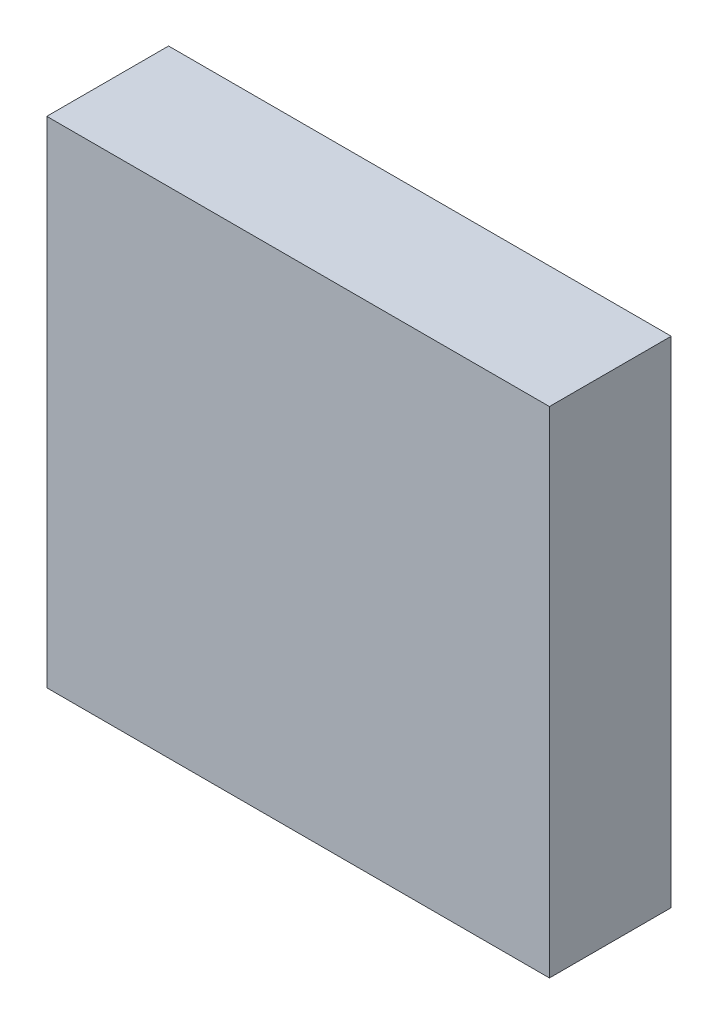
ISO-10303-21;
HEADER;
FILE_DESCRIPTION(('STEP AP214'),'2;1');
FILE_NAME('part.step','',(''),(''),'','','');
FILE_SCHEMA(('AUTOMOTIVE_DESIGN { 1 0 10303 214 1 1 1 1 }'));
ENDSEC;
DATA;
#1=APPLICATION_CONTEXT('core data for automotive mechanical design processes');
#2=APPLICATION_PROTOCOL_DEFINITION('international standard','automotive_design',2000,#1);
#3=PRODUCT_CONTEXT('',#1,'mechanical');
#4=PRODUCT('Part','Part','',(#3));
#5=PRODUCT_RELATED_PRODUCT_CATEGORY('part','',(#4));
#6=PRODUCT_DEFINITION_FORMATION('','',#4);
#7=PRODUCT_DEFINITION_CONTEXT('part definition',#1,'design');
#8=PRODUCT_DEFINITION('design','',#6,#7);
#9=PRODUCT_DEFINITION_SHAPE('','',#8);
#10=(LENGTH_UNIT() NAMED_UNIT(*) SI_UNIT(.MILLI.,.METRE.));
#11=(NAMED_UNIT(*) PLANE_ANGLE_UNIT() SI_UNIT($,.RADIAN.));
#12=(NAMED_UNIT(*) SI_UNIT($,.STERADIAN.) SOLID_ANGLE_UNIT());
#13=UNCERTAINTY_MEASURE_WITH_UNIT(LENGTH_MEASURE(1.E-05),#10,'distance_accuracy_value','');
#14=(GEOMETRIC_REPRESENTATION_CONTEXT(3) GLOBAL_UNCERTAINTY_ASSIGNED_CONTEXT((#13)) GLOBAL_UNIT_ASSIGNED_CONTEXT((#10,
#11,#12)) REPRESENTATION_CONTEXT('',''));
#15=CARTESIAN_POINT('',(0.,0.,0.));
#16=DIRECTION('',(0.,0.,1.));
#17=DIRECTION('',(1.,0.,0.));
#18=AXIS2_PLACEMENT_3D('',#15,#16,#17);
#19=CARTESIAN_POINT('',(-2.0635,2.,1.));
#20=DIRECTION('',(0.,0.,1.));
#21=DIRECTION('',(1.,0.,0.));
#22=AXIS2_PLACEMENT_3D('',#19,#20,#21);
#23=PLANE('',#22);
#24=DIRECTION('',(0.,1.,0.));
#25=VECTOR('',#24,1.);
#26=CARTESIAN_POINT('',(2.0635,2.,1.));
#27=LINE('',#26,#25);
#28=CARTESIAN_POINT('',(2.0635,2.,1.));
#29=VERTEX_POINT('',#28);
#30=CARTESIAN_POINT('',(2.0635,-2.0635,1.));
#31=VERTEX_POINT('',#30);
#32=EDGE_CURVE('E53',#29,#31,#27,.F.);
#33=ORIENTED_EDGE('',*,*,#32,.F.);
#34=DIRECTION('',(1.,0.,0.));
#35=VECTOR('',#34,1.);
#36=CARTESIAN_POINT('',(-2.0635,2.,1.));
#37=LINE('',#36,#35);
#38=CARTESIAN_POINT('',(-2.0635,2.,1.));
#39=VERTEX_POINT('',#38);
#40=EDGE_CURVE('E68',#39,#29,#37,.T.);
#41=ORIENTED_EDGE('',*,*,#40,.F.);
#42=DIRECTION('',(0.,1.,0.));
#43=VECTOR('',#42,1.);
#44=CARTESIAN_POINT('',(-2.0635,-2.0635,1.));
#45=LINE('',#44,#43);
#46=CARTESIAN_POINT('',(-2.0635,-2.0635,1.));
#47=VERTEX_POINT('',#46);
#48=EDGE_CURVE('E20',#47,#39,#45,.T.);
#49=ORIENTED_EDGE('',*,*,#48,.F.);
#50=DIRECTION('',(1.,0.,0.));
#51=VECTOR('',#50,1.);
#52=CARTESIAN_POINT('',(2.0635,-2.0635,1.));
#53=LINE('',#52,#51);
#54=EDGE_CURVE('E58',#31,#47,#53,.F.);
#55=ORIENTED_EDGE('',*,*,#54,.F.);
#56=EDGE_LOOP('',(#33,#41,#49,#55));
#57=FACE_BOUND('',#56,.T.);
#58=ADVANCED_FACE('F17',(#57),#23,.T.);
#59=CARTESIAN_POINT('',(-2.0635,-2.0635,0.));
#60=DIRECTION('',(-1.,0.,0.));
#61=DIRECTION('',(0.,0.,1.));
#62=AXIS2_PLACEMENT_3D('',#59,#60,#61);
#63=PLANE('',#62);
#64=DIRECTION('',(0.,0.,1.));
#65=VECTOR('',#64,1.);
#66=CARTESIAN_POINT('',(-2.0635,2.,0.));
#67=LINE('',#66,#65);
#68=CARTESIAN_POINT('',(-2.0635,2.,0.));
#69=VERTEX_POINT('',#68);
#70=EDGE_CURVE('E79',#69,#39,#67,.T.);
#71=ORIENTED_EDGE('',*,*,#70,.F.);
#72=DIRECTION('',(0.,1.,0.));
#73=VECTOR('',#72,1.);
#74=CARTESIAN_POINT('',(-2.0635,2.,0.));
#75=LINE('',#74,#73);
#76=CARTESIAN_POINT('',(-2.0635,-2.0635,0.));
#77=VERTEX_POINT('',#76);
#78=EDGE_CURVE('E74',#69,#77,#75,.F.);
#79=ORIENTED_EDGE('',*,*,#78,.T.);
#80=DIRECTION('',(0.,0.,-1.));
#81=VECTOR('',#80,1.);
#82=CARTESIAN_POINT('',(-2.0635,-2.0635,0.));
#83=LINE('',#82,#81);
#84=EDGE_CURVE('E63',#47,#77,#83,.T.);
#85=ORIENTED_EDGE('',*,*,#84,.F.);
#86=ORIENTED_EDGE('',*,*,#48,.T.);
#87=EDGE_LOOP('',(#71,#79,#85,#86));
#88=FACE_BOUND('',#87,.T.);
#89=ADVANCED_FACE('F73',(#88),#63,.T.);
#90=CARTESIAN_POINT('',(2.0635,-2.0635,0.));
#91=DIRECTION('',(0.,-1.,0.));
#92=DIRECTION('',(0.,0.,-1.));
#93=AXIS2_PLACEMENT_3D('',#90,#91,#92);
#94=PLANE('',#93);
#95=ORIENTED_EDGE('',*,*,#84,.T.);
#96=DIRECTION('',(1.,0.,0.));
#97=VECTOR('',#96,1.);
#98=CARTESIAN_POINT('',(-2.0635,-2.0635,0.));
#99=LINE('',#98,#97);
#100=CARTESIAN_POINT('',(2.0635,-2.0635,0.));
#101=VERTEX_POINT('',#100);
#102=EDGE_CURVE('E84',#77,#101,#99,.T.);
#103=ORIENTED_EDGE('',*,*,#102,.T.);
#104=DIRECTION('',(0.,0.,-1.));
#105=VECTOR('',#104,1.);
#106=CARTESIAN_POINT('',(2.0635,-2.0635,0.));
#107=LINE('',#106,#105);
#108=EDGE_CURVE('E65',#31,#101,#107,.T.);
#109=ORIENTED_EDGE('',*,*,#108,.F.);
#110=ORIENTED_EDGE('',*,*,#54,.T.);
#111=EDGE_LOOP('',(#95,#103,#109,#110));
#112=FACE_BOUND('',#111,.T.);
#113=ADVANCED_FACE('F60',(#112),#94,.T.);
#114=CARTESIAN_POINT('',(2.0635,2.,0.));
#115=DIRECTION('',(1.,0.,0.));
#116=DIRECTION('',(0.,0.,-1.));
#117=AXIS2_PLACEMENT_3D('',#114,#115,#116);
#118=PLANE('',#117);
#119=ORIENTED_EDGE('',*,*,#108,.T.);
#120=DIRECTION('',(0.,1.,0.));
#121=VECTOR('',#120,1.);
#122=CARTESIAN_POINT('',(2.0635,2.,0.));
#123=LINE('',#122,#121);
#124=CARTESIAN_POINT('',(2.0635,2.,0.));
#125=VERTEX_POINT('',#124);
#126=EDGE_CURVE('E26',#101,#125,#123,.T.);
#127=ORIENTED_EDGE('',*,*,#126,.T.);
#128=DIRECTION('',(0.,0.,1.));
#129=VECTOR('',#128,1.);
#130=CARTESIAN_POINT('',(2.0635,2.,0.));
#131=LINE('',#130,#129);
#132=EDGE_CURVE('E34',#29,#125,#131,.F.);
#133=ORIENTED_EDGE('',*,*,#132,.F.);
#134=ORIENTED_EDGE('',*,*,#32,.T.);
#135=EDGE_LOOP('',(#119,#127,#133,#134));
#136=FACE_BOUND('',#135,.T.);
#137=ADVANCED_FACE('F88',(#136),#118,.T.);
#138=CARTESIAN_POINT('',(-2.0635,2.,0.));
#139=DIRECTION('',(0.,1.,0.));
#140=DIRECTION('',(0.,0.,1.));
#141=AXIS2_PLACEMENT_3D('',#138,#139,#140);
#142=PLANE('',#141);
#143=ORIENTED_EDGE('',*,*,#132,.T.);
#144=DIRECTION('',(1.,0.,0.));
#145=VECTOR('',#144,1.);
#146=CARTESIAN_POINT('',(-2.0635,2.,0.));
#147=LINE('',#146,#145);
#148=EDGE_CURVE('E11',#125,#69,#147,.F.);
#149=ORIENTED_EDGE('',*,*,#148,.T.);
#150=ORIENTED_EDGE('',*,*,#70,.T.);
#151=ORIENTED_EDGE('',*,*,#40,.T.);
#152=EDGE_LOOP('',(#143,#149,#150,#151));
#153=FACE_BOUND('',#152,.T.);
#154=ADVANCED_FACE('F91',(#153),#142,.T.);
#155=CARTESIAN_POINT('',(-2.0635,2.,0.));
#156=DIRECTION('',(0.,0.,1.));
#157=DIRECTION('',(1.,0.,0.));
#158=AXIS2_PLACEMENT_3D('',#155,#156,#157);
#159=PLANE('',#158);
#160=ORIENTED_EDGE('',*,*,#126,.F.);
#161=ORIENTED_EDGE('',*,*,#102,.F.);
#162=ORIENTED_EDGE('',*,*,#78,.F.);
#163=ORIENTED_EDGE('',*,*,#148,.F.);
#164=EDGE_LOOP('',(#160,#161,#162,#163));
#165=FACE_BOUND('',#164,.T.);
#166=ADVANCED_FACE('F90',(#165),#159,.F.);
#167=CLOSED_SHELL('',(#58,#89,#113,#137,#154,#166));
#168=MANIFOLD_SOLID_BREP('B1',#167);
#169=ADVANCED_BREP_SHAPE_REPRESENTATION('',(#18,#168),#14);
#170=SHAPE_DEFINITION_REPRESENTATION(#9,#169);
ENDSEC;
END-ISO-10303-21;
